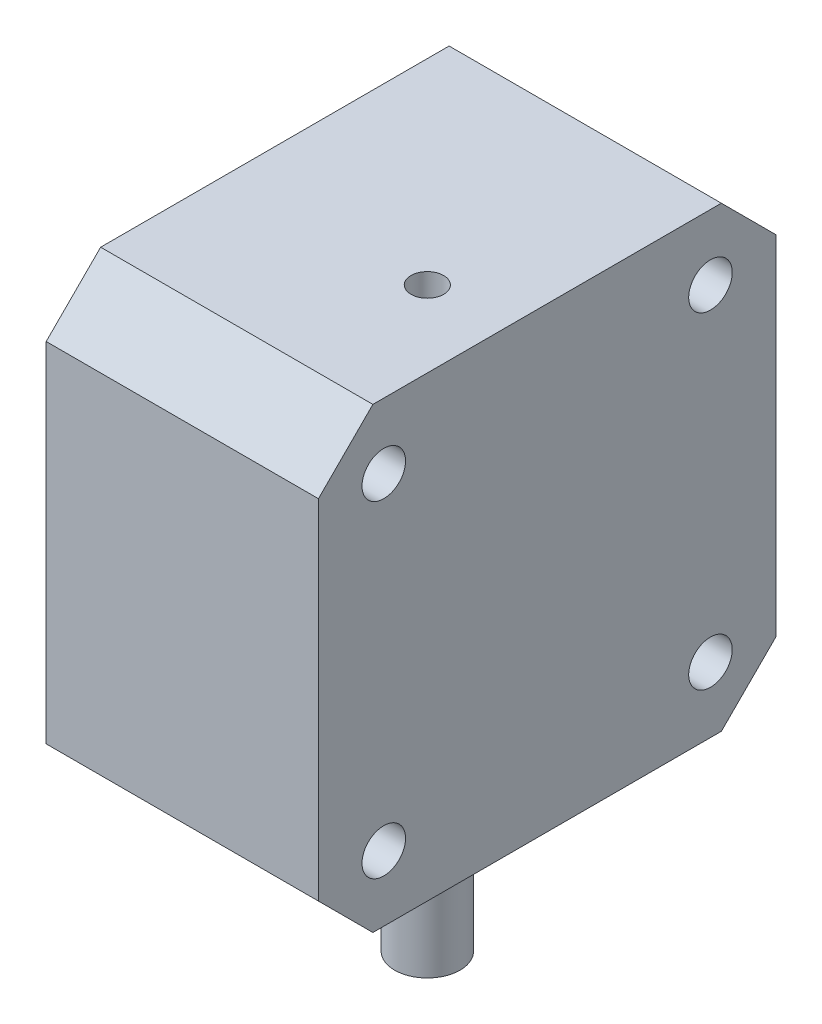
ISO-10303-21;
HEADER;
FILE_DESCRIPTION(('STEP AP214'),'2;1');
FILE_NAME('part.step','',(''),(''),'','','');
FILE_SCHEMA(('AUTOMOTIVE_DESIGN { 1 0 10303 214 1 1 1 1 }'));
ENDSEC;
DATA;
#1=APPLICATION_CONTEXT('core data for automotive mechanical design processes');
#2=APPLICATION_PROTOCOL_DEFINITION('international standard','automotive_design',2000,#1);
#3=PRODUCT_CONTEXT('',#1,'mechanical');
#4=PRODUCT('Part','Part','',(#3));
#5=PRODUCT_RELATED_PRODUCT_CATEGORY('part','',(#4));
#6=PRODUCT_DEFINITION_FORMATION('','',#4);
#7=PRODUCT_DEFINITION_CONTEXT('part definition',#1,'design');
#8=PRODUCT_DEFINITION('design','',#6,#7);
#9=PRODUCT_DEFINITION_SHAPE('','',#8);
#10=(LENGTH_UNIT() NAMED_UNIT(*) SI_UNIT(.MILLI.,.METRE.));
#11=(NAMED_UNIT(*) PLANE_ANGLE_UNIT() SI_UNIT($,.RADIAN.));
#12=(NAMED_UNIT(*) SI_UNIT($,.STERADIAN.) SOLID_ANGLE_UNIT());
#13=UNCERTAINTY_MEASURE_WITH_UNIT(LENGTH_MEASURE(1.E-05),#10,'distance_accuracy_value','');
#14=(GEOMETRIC_REPRESENTATION_CONTEXT(3) GLOBAL_UNCERTAINTY_ASSIGNED_CONTEXT((#13)) GLOBAL_UNIT_ASSIGNED_CONTEXT((#10,
#11,#12)) REPRESENTATION_CONTEXT('',''));
#15=CARTESIAN_POINT('',(0.,0.,0.));
#16=DIRECTION('',(0.,0.,1.));
#17=DIRECTION('',(1.,0.,0.));
#18=AXIS2_PLACEMENT_3D('',#15,#16,#17);
#19=CARTESIAN_POINT('',(25.,0.,0.));
#20=DIRECTION('',(0.,0.,-1.));
#21=DIRECTION('',(-1.,0.,0.));
#22=AXIS2_PLACEMENT_3D('',#19,#20,#21);
#23=PLANE('',#22);
#24=DIRECTION('',(0.,-1.,0.));
#25=VECTOR('',#24,1.);
#26=CARTESIAN_POINT('',(0.,0.,0.));
#27=LINE('',#26,#25);
#28=CARTESIAN_POINT('',(0.,37.,0.));
#29=VERTEX_POINT('',#28);
#30=CARTESIAN_POINT('',(0.,5.00000000000002,0.));
#31=VERTEX_POINT('',#30);
#32=EDGE_CURVE('E144',#29,#31,#27,.T.);
#33=ORIENTED_EDGE('',*,*,#32,.T.);
#34=DIRECTION('',(1.,0.,0.));
#35=VECTOR('',#34,1.);
#36=CARTESIAN_POINT('',(25.,5.00000000000002,0.));
#37=LINE('',#36,#35);
#38=CARTESIAN_POINT('',(25.,5.00000000000002,0.));
#39=VERTEX_POINT('',#38);
#40=EDGE_CURVE('E119',#31,#39,#37,.T.);
#41=ORIENTED_EDGE('',*,*,#40,.T.);
#42=DIRECTION('',(0.,-1.,0.));
#43=VECTOR('',#42,1.);
#44=CARTESIAN_POINT('',(25.,0.,0.));
#45=LINE('',#44,#43);
#46=CARTESIAN_POINT('',(25.,37.,0.));
#47=VERTEX_POINT('',#46);
#48=EDGE_CURVE('E157',#47,#39,#45,.T.);
#49=ORIENTED_EDGE('',*,*,#48,.F.);
#50=DIRECTION('',(-1.,0.,0.));
#51=VECTOR('',#50,1.);
#52=CARTESIAN_POINT('',(25.,37.,0.));
#53=LINE('',#52,#51);
#54=EDGE_CURVE('E125',#47,#29,#53,.T.);
#55=ORIENTED_EDGE('',*,*,#54,.T.);
#56=EDGE_LOOP('',(#33,#41,#49,#55));
#57=FACE_BOUND('',#56,.T.);
#58=ADVANCED_FACE('F47',(#57),#23,.F.);
#59=CARTESIAN_POINT('',(25.,0.,0.));
#60=DIRECTION('',(0.,1.,0.));
#61=DIRECTION('',(0.,0.,1.));
#62=AXIS2_PLACEMENT_3D('',#59,#60,#61);
#63=PLANE('',#62);
#64=CARTESIAN_POINT('',(18.,0.,-17.));
#65=DIRECTION('',(0.,1.,0.));
#66=DIRECTION('',(0.,0.,1.));
#67=AXIS2_PLACEMENT_3D('',#64,#65,#66);
#68=CIRCLE('',#67,3.);
#69=CARTESIAN_POINT('',(18.,0.,-14.));
#70=VERTEX_POINT('',#69);
#71=EDGE_CURVE('E158',#70,#70,#68,.F.);
#72=ORIENTED_EDGE('',*,*,#71,.F.);
#73=EDGE_LOOP('',(#72));
#74=FACE_BOUND('',#73,.T.);
#75=DIRECTION('',(0.,0.,-1.));
#76=VECTOR('',#75,1.);
#77=CARTESIAN_POINT('',(25.,0.,0.));
#78=LINE('',#77,#76);
#79=CARTESIAN_POINT('',(25.,0.,-5.));
#80=VERTEX_POINT('',#79);
#81=CARTESIAN_POINT('',(25.,0.,-37.));
#82=VERTEX_POINT('',#81);
#83=EDGE_CURVE('E135',#80,#82,#78,.T.);
#84=ORIENTED_EDGE('',*,*,#83,.F.);
#85=DIRECTION('',(-1.,0.,0.));
#86=VECTOR('',#85,1.);
#87=CARTESIAN_POINT('',(25.,0.,-5.));
#88=LINE('',#87,#86);
#89=CARTESIAN_POINT('',(0.,0.,-5.));
#90=VERTEX_POINT('',#89);
#91=EDGE_CURVE('E118',#80,#90,#88,.T.);
#92=ORIENTED_EDGE('',*,*,#91,.T.);
#93=DIRECTION('',(0.,0.,-1.));
#94=VECTOR('',#93,1.);
#95=CARTESIAN_POINT('',(0.,0.,0.));
#96=LINE('',#95,#94);
#97=CARTESIAN_POINT('',(0.,0.,-37.));
#98=VERTEX_POINT('',#97);
#99=EDGE_CURVE('E132',#90,#98,#96,.T.);
#100=ORIENTED_EDGE('',*,*,#99,.T.);
#101=DIRECTION('',(1.,0.,0.));
#102=VECTOR('',#101,1.);
#103=CARTESIAN_POINT('',(25.,0.,-37.));
#104=LINE('',#103,#102);
#105=EDGE_CURVE('E138',#98,#82,#104,.T.);
#106=ORIENTED_EDGE('',*,*,#105,.T.);
#107=EDGE_LOOP('',(#84,#92,#100,#106));
#108=FACE_BOUND('',#107,.T.);
#109=ADVANCED_FACE('F131',(#74,#108),#63,.F.);
#110=CARTESIAN_POINT('',(25.,0.,-42.));
#111=DIRECTION('',(0.,0.,1.));
#112=DIRECTION('',(1.,0.,0.));
#113=AXIS2_PLACEMENT_3D('',#110,#111,#112);
#114=PLANE('',#113);
#115=DIRECTION('',(0.,1.,0.));
#116=VECTOR('',#115,1.);
#117=CARTESIAN_POINT('',(25.,0.,-42.));
#118=LINE('',#117,#116);
#119=CARTESIAN_POINT('',(25.,5.,-42.));
#120=VERTEX_POINT('',#119);
#121=CARTESIAN_POINT('',(25.,37.,-42.));
#122=VERTEX_POINT('',#121);
#123=EDGE_CURVE('E227',#120,#122,#118,.T.);
#124=ORIENTED_EDGE('',*,*,#123,.F.);
#125=DIRECTION('',(-1.,0.,0.));
#126=VECTOR('',#125,1.);
#127=CARTESIAN_POINT('',(25.,5.,-42.));
#128=LINE('',#127,#126);
#129=CARTESIAN_POINT('',(0.,5.,-42.));
#130=VERTEX_POINT('',#129);
#131=EDGE_CURVE('E208',#120,#130,#128,.T.);
#132=ORIENTED_EDGE('',*,*,#131,.T.);
#133=DIRECTION('',(0.,1.,0.));
#134=VECTOR('',#133,1.);
#135=CARTESIAN_POINT('',(0.,0.,-42.));
#136=LINE('',#135,#134);
#137=CARTESIAN_POINT('',(0.,37.,-42.));
#138=VERTEX_POINT('',#137);
#139=EDGE_CURVE('E143',#130,#138,#136,.T.);
#140=ORIENTED_EDGE('',*,*,#139,.T.);
#141=DIRECTION('',(1.,0.,0.));
#142=VECTOR('',#141,1.);
#143=CARTESIAN_POINT('',(25.,37.,-42.));
#144=LINE('',#143,#142);
#145=EDGE_CURVE('E205',#138,#122,#144,.T.);
#146=ORIENTED_EDGE('',*,*,#145,.T.);
#147=EDGE_LOOP('',(#124,#132,#140,#146));
#148=FACE_BOUND('',#147,.T.);
#149=ADVANCED_FACE('F245',(#148),#114,.F.);
#150=CARTESIAN_POINT('',(25.,42.,0.));
#151=DIRECTION('',(0.,-1.,0.));
#152=DIRECTION('',(0.,0.,-1.));
#153=AXIS2_PLACEMENT_3D('',#150,#151,#152);
#154=PLANE('',#153);
#155=CARTESIAN_POINT('',(18.,42.,-17.));
#156=DIRECTION('',(0.,-1.,0.));
#157=DIRECTION('',(0.,0.,-1.));
#158=AXIS2_PLACEMENT_3D('',#155,#156,#157);
#159=CIRCLE('',#158,1.5);
#160=CARTESIAN_POINT('',(18.,42.,-18.5));
#161=VERTEX_POINT('',#160);
#162=EDGE_CURVE('E403',#161,#161,#159,.T.);
#163=ORIENTED_EDGE('',*,*,#162,.T.);
#164=EDGE_LOOP('',(#163));
#165=FACE_BOUND('',#164,.T.);
#166=DIRECTION('',(0.,0.,1.));
#167=VECTOR('',#166,1.);
#168=CARTESIAN_POINT('',(0.,42.,0.));
#169=LINE('',#168,#167);
#170=CARTESIAN_POINT('',(0.,42.,-37.));
#171=VERTEX_POINT('',#170);
#172=CARTESIAN_POINT('',(0.,42.,-5.00000000000001));
#173=VERTEX_POINT('',#172);
#174=EDGE_CURVE('E149',#171,#173,#169,.T.);
#175=ORIENTED_EDGE('',*,*,#174,.T.);
#176=DIRECTION('',(1.,0.,0.));
#177=VECTOR('',#176,1.);
#178=CARTESIAN_POINT('',(25.,42.,-5.00000000000002));
#179=LINE('',#178,#177);
#180=CARTESIAN_POINT('',(25.,42.,-5.00000000000001));
#181=VERTEX_POINT('',#180);
#182=EDGE_CURVE('E11',#173,#181,#179,.T.);
#183=ORIENTED_EDGE('',*,*,#182,.T.);
#184=DIRECTION('',(0.,0.,1.));
#185=VECTOR('',#184,1.);
#186=CARTESIAN_POINT('',(25.,42.,0.));
#187=LINE('',#186,#185);
#188=CARTESIAN_POINT('',(25.,42.,-37.));
#189=VERTEX_POINT('',#188);
#190=EDGE_CURVE('E162',#189,#181,#187,.T.);
#191=ORIENTED_EDGE('',*,*,#190,.F.);
#192=DIRECTION('',(-1.,0.,0.));
#193=VECTOR('',#192,1.);
#194=CARTESIAN_POINT('',(25.,42.,-37.));
#195=LINE('',#194,#193);
#196=EDGE_CURVE('E57',#189,#171,#195,.T.);
#197=ORIENTED_EDGE('',*,*,#196,.T.);
#198=EDGE_LOOP('',(#175,#183,#191,#197));
#199=FACE_BOUND('',#198,.T.);
#200=ADVANCED_FACE('F215',(#165,#199),#154,.F.);
#201=CARTESIAN_POINT('',(25.,0.,0.));
#202=DIRECTION('',(-1.,0.,0.));
#203=DIRECTION('',(0.,0.,1.));
#204=AXIS2_PLACEMENT_3D('',#201,#202,#203);
#205=PLANE('',#204);
#206=CARTESIAN_POINT('',(25.,36.,-36.));
#207=DIRECTION('',(1.,0.,0.));
#208=DIRECTION('',(0.,0.,-1.));
#209=AXIS2_PLACEMENT_3D('',#206,#207,#208);
#210=CIRCLE('',#209,2.);
#211=CARTESIAN_POINT('',(25.,36.,-38.));
#212=VERTEX_POINT('',#211);
#213=EDGE_CURVE('E414',#212,#212,#210,.T.);
#214=ORIENTED_EDGE('',*,*,#213,.F.);
#215=EDGE_LOOP('',(#214));
#216=FACE_BOUND('',#215,.T.);
#217=CARTESIAN_POINT('',(25.,6.,-6.00000000000001));
#218=DIRECTION('',(1.,0.,0.));
#219=DIRECTION('',(0.,0.,-1.));
#220=AXIS2_PLACEMENT_3D('',#217,#218,#219);
#221=CIRCLE('',#220,2.);
#222=CARTESIAN_POINT('',(25.,6.,-8.00000000000001));
#223=VERTEX_POINT('',#222);
#224=EDGE_CURVE('E410',#223,#223,#221,.T.);
#225=ORIENTED_EDGE('',*,*,#224,.F.);
#226=EDGE_LOOP('',(#225));
#227=FACE_BOUND('',#226,.T.);
#228=CARTESIAN_POINT('',(25.,6.,-36.));
#229=DIRECTION('',(1.,0.,0.));
#230=DIRECTION('',(0.,0.,-1.));
#231=AXIS2_PLACEMENT_3D('',#228,#229,#230);
#232=CIRCLE('',#231,2.);
#233=CARTESIAN_POINT('',(25.,6.,-38.));
#234=VERTEX_POINT('',#233);
#235=EDGE_CURVE('E405',#234,#234,#232,.T.);
#236=ORIENTED_EDGE('',*,*,#235,.F.);
#237=EDGE_LOOP('',(#236));
#238=FACE_BOUND('',#237,.T.);
#239=CARTESIAN_POINT('',(25.,36.,-6.00000000000001));
#240=DIRECTION('',(1.,0.,0.));
#241=DIRECTION('',(0.,0.,-1.));
#242=AXIS2_PLACEMENT_3D('',#239,#240,#241);
#243=CIRCLE('',#242,2.);
#244=CARTESIAN_POINT('',(25.,36.,-8.00000000000001));
#245=VERTEX_POINT('',#244);
#246=EDGE_CURVE('E168',#245,#245,#243,.T.);
#247=ORIENTED_EDGE('',*,*,#246,.F.);
#248=EDGE_LOOP('',(#247));
#249=FACE_BOUND('',#248,.T.);
#250=ORIENTED_EDGE('',*,*,#48,.T.);
#251=DIRECTION('',(0.,0.707106781186549,0.707106781186546));
#252=VECTOR('',#251,1.);
#253=CARTESIAN_POINT('',(25.,0.,-5.));
#254=LINE('',#253,#252);
#255=EDGE_CURVE('E202',#39,#80,#254,.F.);
#256=ORIENTED_EDGE('',*,*,#255,.T.);
#257=ORIENTED_EDGE('',*,*,#83,.T.);
#258=DIRECTION('',(0.,-0.707106781186545,0.70710678118655));
#259=VECTOR('',#258,1.);
#260=CARTESIAN_POINT('',(25.,5.,-42.));
#261=LINE('',#260,#259);
#262=EDGE_CURVE('E199',#82,#120,#261,.F.);
#263=ORIENTED_EDGE('',*,*,#262,.T.);
#264=ORIENTED_EDGE('',*,*,#123,.T.);
#265=DIRECTION('',(0.,-0.70710678118655,-0.707106781186546));
#266=VECTOR('',#265,1.);
#267=CARTESIAN_POINT('',(25.,42.,-37.));
#268=LINE('',#267,#266);
#269=EDGE_CURVE('E69',#122,#189,#268,.F.);
#270=ORIENTED_EDGE('',*,*,#269,.T.);
#271=ORIENTED_EDGE('',*,*,#190,.T.);
#272=DIRECTION('',(0.,0.707106781186546,-0.707106781186549));
#273=VECTOR('',#272,1.);
#274=CARTESIAN_POINT('',(25.,37.,0.));
#275=LINE('',#274,#273);
#276=EDGE_CURVE('E196',#181,#47,#275,.F.);
#277=ORIENTED_EDGE('',*,*,#276,.T.);
#278=EDGE_LOOP('',(#250,#256,#257,#263,#264,#270,#271,#277));
#279=FACE_BOUND('',#278,.T.);
#280=ADVANCED_FACE('F234',(#216,#227,#238,#249,#279),#205,.F.);
#281=CARTESIAN_POINT('',(0.,0.,0.));
#282=DIRECTION('',(-1.,0.,0.));
#283=DIRECTION('',(0.,0.,1.));
#284=AXIS2_PLACEMENT_3D('',#281,#282,#283);
#285=PLANE('',#284);
#286=CARTESIAN_POINT('',(0.,36.,-36.));
#287=DIRECTION('',(-1.,0.,0.));
#288=DIRECTION('',(0.,0.,1.));
#289=AXIS2_PLACEMENT_3D('',#286,#287,#288);
#290=CIRCLE('',#289,2.);
#291=CARTESIAN_POINT('',(0.,36.,-34.));
#292=VERTEX_POINT('',#291);
#293=EDGE_CURVE('E176',#292,#292,#290,.T.);
#294=ORIENTED_EDGE('',*,*,#293,.F.);
#295=EDGE_LOOP('',(#294));
#296=FACE_BOUND('',#295,.T.);
#297=CARTESIAN_POINT('',(0.,6.,-6.00000000000001));
#298=DIRECTION('',(-1.,0.,0.));
#299=DIRECTION('',(0.,0.,1.));
#300=AXIS2_PLACEMENT_3D('',#297,#298,#299);
#301=CIRCLE('',#300,2.);
#302=CARTESIAN_POINT('',(0.,6.,-4.00000000000001));
#303=VERTEX_POINT('',#302);
#304=EDGE_CURVE('E172',#303,#303,#301,.T.);
#305=ORIENTED_EDGE('',*,*,#304,.F.);
#306=EDGE_LOOP('',(#305));
#307=FACE_BOUND('',#306,.T.);
#308=CARTESIAN_POINT('',(0.,6.,-36.));
#309=DIRECTION('',(-1.,0.,0.));
#310=DIRECTION('',(0.,0.,1.));
#311=AXIS2_PLACEMENT_3D('',#308,#309,#310);
#312=CIRCLE('',#311,2.);
#313=CARTESIAN_POINT('',(0.,6.,-34.));
#314=VERTEX_POINT('',#313);
#315=EDGE_CURVE('E167',#314,#314,#312,.T.);
#316=ORIENTED_EDGE('',*,*,#315,.F.);
#317=EDGE_LOOP('',(#316));
#318=FACE_BOUND('',#317,.T.);
#319=CARTESIAN_POINT('',(0.,36.,-6.00000000000001));
#320=DIRECTION('',(-1.,0.,0.));
#321=DIRECTION('',(0.,0.,1.));
#322=AXIS2_PLACEMENT_3D('',#319,#320,#321);
#323=CIRCLE('',#322,2.);
#324=CARTESIAN_POINT('',(0.,36.,-4.00000000000001));
#325=VERTEX_POINT('',#324);
#326=EDGE_CURVE('E163',#325,#325,#323,.T.);
#327=ORIENTED_EDGE('',*,*,#326,.F.);
#328=EDGE_LOOP('',(#327));
#329=FACE_BOUND('',#328,.T.);
#330=ORIENTED_EDGE('',*,*,#99,.F.);
#331=DIRECTION('',(0.,-0.707106781186549,-0.707106781186546));
#332=VECTOR('',#331,1.);
#333=CARTESIAN_POINT('',(0.,2.5,-2.50000000000001));
#334=LINE('',#333,#332);
#335=EDGE_CURVE('E114',#90,#31,#334,.F.);
#336=ORIENTED_EDGE('',*,*,#335,.T.);
#337=ORIENTED_EDGE('',*,*,#32,.F.);
#338=DIRECTION('',(0.,-0.707106781186546,0.707106781186549));
#339=VECTOR('',#338,1.);
#340=CARTESIAN_POINT('',(0.,18.5000000000001,18.5));
#341=LINE('',#340,#339);
#342=EDGE_CURVE('E184',#29,#173,#341,.F.);
#343=ORIENTED_EDGE('',*,*,#342,.T.);
#344=ORIENTED_EDGE('',*,*,#174,.F.);
#345=DIRECTION('',(0.,0.70710678118655,0.707106781186546));
#346=VECTOR('',#345,1.);
#347=CARTESIAN_POINT('',(0.,39.4999999999999,-39.5000000000001));
#348=LINE('',#347,#346);
#349=EDGE_CURVE('E137',#171,#138,#348,.F.);
#350=ORIENTED_EDGE('',*,*,#349,.T.);
#351=ORIENTED_EDGE('',*,*,#139,.F.);
#352=DIRECTION('',(0.,0.707106781186545,-0.70710678118655));
#353=VECTOR('',#352,1.);
#354=CARTESIAN_POINT('',(0.,-18.5,-18.4999999999999));
#355=LINE('',#354,#353);
#356=EDGE_CURVE('E126',#130,#98,#355,.F.);
#357=ORIENTED_EDGE('',*,*,#356,.T.);
#358=EDGE_LOOP('',(#330,#336,#337,#343,#344,#350,#351,#357));
#359=FACE_BOUND('',#358,.T.);
#360=ADVANCED_FACE('F140',(#296,#307,#318,#329,#359),#285,.T.);
#361=CARTESIAN_POINT('',(18.,-11.,-17.));
#362=DIRECTION('',(0.,1.,0.));
#363=DIRECTION('',(0.,0.,1.));
#364=AXIS2_PLACEMENT_3D('',#361,#362,#363);
#365=CYLINDRICAL_SURFACE('',#364,3.);
#366=CARTESIAN_POINT('',(18.,-11.,-17.));
#367=DIRECTION('',(0.,-1.,0.));
#368=DIRECTION('',(0.,0.,-1.));
#369=AXIS2_PLACEMENT_3D('',#366,#367,#368);
#370=CIRCLE('',#369,3.);
#371=CARTESIAN_POINT('',(18.,-11.,-20.));
#372=VERTEX_POINT('',#371);
#373=EDGE_CURVE('E151',#372,#372,#370,.T.);
#374=ORIENTED_EDGE('',*,*,#373,.F.);
#375=EDGE_LOOP('',(#374));
#376=FACE_BOUND('',#375,.T.);
#377=ORIENTED_EDGE('',*,*,#71,.T.);
#378=EDGE_LOOP('',(#377));
#379=FACE_BOUND('',#378,.T.);
#380=ADVANCED_FACE('F242',(#376,#379),#365,.T.);
#381=CARTESIAN_POINT('',(18.,-11.,-17.));
#382=DIRECTION('',(0.,-1.,0.));
#383=DIRECTION('',(0.,0.,-1.));
#384=AXIS2_PLACEMENT_3D('',#381,#382,#383);
#385=PLANE('',#384);
#386=CARTESIAN_POINT('',(18.,-11.,-17.));
#387=DIRECTION('',(0.,-1.,0.));
#388=DIRECTION('',(0.,0.,-1.));
#389=AXIS2_PLACEMENT_3D('',#386,#387,#388);
#390=CIRCLE('',#389,1.5);
#391=CARTESIAN_POINT('',(18.,-11.,-18.5));
#392=VERTEX_POINT('',#391);
#393=EDGE_CURVE('E400',#392,#392,#390,.T.);
#394=ORIENTED_EDGE('',*,*,#393,.F.);
#395=EDGE_LOOP('',(#394));
#396=FACE_BOUND('',#395,.T.);
#397=ORIENTED_EDGE('',*,*,#373,.T.);
#398=EDGE_LOOP('',(#397));
#399=FACE_BOUND('',#398,.T.);
#400=ADVANCED_FACE('F317',(#396,#399),#385,.T.);
#401=CARTESIAN_POINT('',(-17.,36.,-6.00000000000001));
#402=DIRECTION('',(1.,0.,0.));
#403=DIRECTION('',(0.,0.,-1.));
#404=AXIS2_PLACEMENT_3D('',#401,#402,#403);
#405=CYLINDRICAL_SURFACE('',#404,2.);
#406=ORIENTED_EDGE('',*,*,#326,.T.);
#407=EDGE_LOOP('',(#406));
#408=FACE_BOUND('',#407,.T.);
#409=ORIENTED_EDGE('',*,*,#246,.T.);
#410=EDGE_LOOP('',(#409));
#411=FACE_BOUND('',#410,.T.);
#412=ADVANCED_FACE('F327',(#408,#411),#405,.F.);
#413=CARTESIAN_POINT('',(-17.,6.,-36.));
#414=DIRECTION('',(1.,0.,0.));
#415=DIRECTION('',(0.,0.,-1.));
#416=AXIS2_PLACEMENT_3D('',#413,#414,#415);
#417=CYLINDRICAL_SURFACE('',#416,2.);
#418=ORIENTED_EDGE('',*,*,#315,.T.);
#419=EDGE_LOOP('',(#418));
#420=FACE_BOUND('',#419,.T.);
#421=ORIENTED_EDGE('',*,*,#235,.T.);
#422=EDGE_LOOP('',(#421));
#423=FACE_BOUND('',#422,.T.);
#424=ADVANCED_FACE('F337',(#420,#423),#417,.F.);
#425=CARTESIAN_POINT('',(-17.,6.,-6.00000000000001));
#426=DIRECTION('',(1.,0.,0.));
#427=DIRECTION('',(0.,0.,-1.));
#428=AXIS2_PLACEMENT_3D('',#425,#426,#427);
#429=CYLINDRICAL_SURFACE('',#428,2.);
#430=ORIENTED_EDGE('',*,*,#304,.T.);
#431=EDGE_LOOP('',(#430));
#432=FACE_BOUND('',#431,.T.);
#433=ORIENTED_EDGE('',*,*,#224,.T.);
#434=EDGE_LOOP('',(#433));
#435=FACE_BOUND('',#434,.T.);
#436=ADVANCED_FACE('F347',(#432,#435),#429,.F.);
#437=CARTESIAN_POINT('',(-17.,36.,-36.));
#438=DIRECTION('',(1.,0.,0.));
#439=DIRECTION('',(0.,0.,-1.));
#440=AXIS2_PLACEMENT_3D('',#437,#438,#439);
#441=CYLINDRICAL_SURFACE('',#440,2.);
#442=ORIENTED_EDGE('',*,*,#293,.T.);
#443=EDGE_LOOP('',(#442));
#444=FACE_BOUND('',#443,.T.);
#445=ORIENTED_EDGE('',*,*,#213,.T.);
#446=EDGE_LOOP('',(#445));
#447=FACE_BOUND('',#446,.T.);
#448=ADVANCED_FACE('F357',(#444,#447),#441,.F.);
#449=CARTESIAN_POINT('',(18.,89.,-17.));
#450=DIRECTION('',(0.,-1.,0.));
#451=DIRECTION('',(0.,0.,-1.));
#452=AXIS2_PLACEMENT_3D('',#449,#450,#451);
#453=CYLINDRICAL_SURFACE('',#452,1.5);
#454=ORIENTED_EDGE('',*,*,#393,.T.);
#455=EDGE_LOOP('',(#454));
#456=FACE_BOUND('',#455,.T.);
#457=ORIENTED_EDGE('',*,*,#162,.F.);
#458=EDGE_LOOP('',(#457));
#459=FACE_BOUND('',#458,.T.);
#460=ADVANCED_FACE('F268',(#456,#459),#453,.F.);
#461=CARTESIAN_POINT('',(25.,0.,-5.));
#462=DIRECTION('',(0.,0.707106781186546,-0.707106781186549));
#463=DIRECTION('',(-1.,0.,0.));
#464=AXIS2_PLACEMENT_3D('',#461,#462,#463);
#465=PLANE('',#464);
#466=ORIENTED_EDGE('',*,*,#255,.F.);
#467=ORIENTED_EDGE('',*,*,#40,.F.);
#468=ORIENTED_EDGE('',*,*,#335,.F.);
#469=ORIENTED_EDGE('',*,*,#91,.F.);
#470=EDGE_LOOP('',(#466,#467,#468,#469));
#471=FACE_BOUND('',#470,.T.);
#472=ADVANCED_FACE('F117',(#471),#465,.F.);
#473=CARTESIAN_POINT('',(25.,5.,-42.));
#474=DIRECTION('',(0.,0.70710678118655,0.707106781186545));
#475=DIRECTION('',(-1.,0.,0.));
#476=AXIS2_PLACEMENT_3D('',#473,#474,#475);
#477=PLANE('',#476);
#478=ORIENTED_EDGE('',*,*,#262,.F.);
#479=ORIENTED_EDGE('',*,*,#105,.F.);
#480=ORIENTED_EDGE('',*,*,#356,.F.);
#481=ORIENTED_EDGE('',*,*,#131,.F.);
#482=EDGE_LOOP('',(#478,#479,#480,#481));
#483=FACE_BOUND('',#482,.T.);
#484=ADVANCED_FACE('F267',(#483),#477,.F.);
#485=CARTESIAN_POINT('',(25.,37.,0.));
#486=DIRECTION('',(0.,-0.707106781186549,-0.707106781186546));
#487=DIRECTION('',(-1.,0.,0.));
#488=AXIS2_PLACEMENT_3D('',#485,#486,#487);
#489=PLANE('',#488);
#490=ORIENTED_EDGE('',*,*,#276,.F.);
#491=ORIENTED_EDGE('',*,*,#182,.F.);
#492=ORIENTED_EDGE('',*,*,#342,.F.);
#493=ORIENTED_EDGE('',*,*,#54,.F.);
#494=EDGE_LOOP('',(#490,#491,#492,#493));
#495=FACE_BOUND('',#494,.T.);
#496=ADVANCED_FACE('F220',(#495),#489,.F.);
#497=CARTESIAN_POINT('',(25.,42.,-37.));
#498=DIRECTION('',(0.,-0.707106781186546,0.70710678118655));
#499=DIRECTION('',(-1.,0.,0.));
#500=AXIS2_PLACEMENT_3D('',#497,#498,#499);
#501=PLANE('',#500);
#502=ORIENTED_EDGE('',*,*,#269,.F.);
#503=ORIENTED_EDGE('',*,*,#145,.F.);
#504=ORIENTED_EDGE('',*,*,#349,.F.);
#505=ORIENTED_EDGE('',*,*,#196,.F.);
#506=EDGE_LOOP('',(#502,#503,#504,#505));
#507=FACE_BOUND('',#506,.T.);
#508=ADVANCED_FACE('F50',(#507),#501,.F.);
#509=CLOSED_SHELL('',(#58,#109,#149,#200,#280,#360,#380,#400,#412,#424,#436,#448,#460,#472,#484,
#496,#508));
#510=MANIFOLD_SOLID_BREP('B2',#509);
#511=ADVANCED_BREP_SHAPE_REPRESENTATION('',(#18,#510),#14);
#512=SHAPE_DEFINITION_REPRESENTATION(#9,#511);
ENDSEC;
END-ISO-10303-21;
